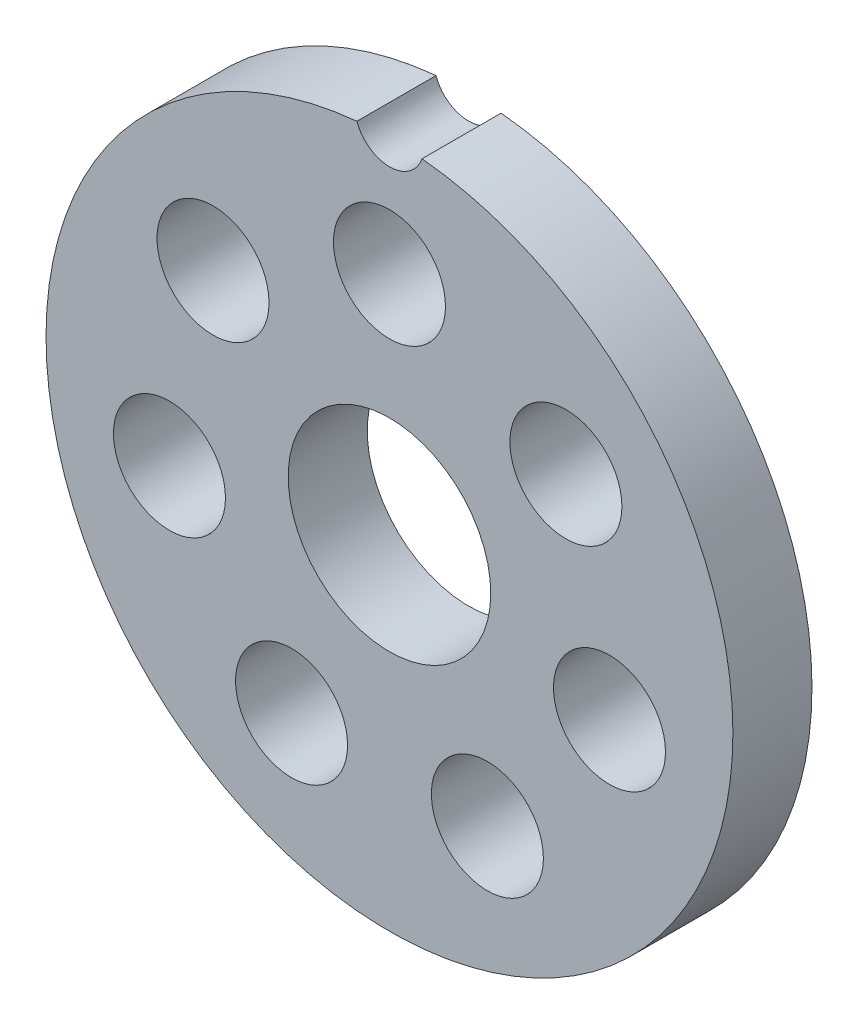
ISO-10303-21;
HEADER;
FILE_DESCRIPTION(('STEP AP214'),'2;1');
FILE_NAME('part.step','',(''),(''),'','','');
FILE_SCHEMA(('AUTOMOTIVE_DESIGN { 1 0 10303 214 1 1 1 1 }'));
ENDSEC;
DATA;
#1=APPLICATION_CONTEXT('core data for automotive mechanical design processes');
#2=APPLICATION_PROTOCOL_DEFINITION('international standard','automotive_design',2000,#1);
#3=PRODUCT_CONTEXT('',#1,'mechanical');
#4=PRODUCT('Part','Part','',(#3));
#5=PRODUCT_RELATED_PRODUCT_CATEGORY('part','',(#4));
#6=PRODUCT_DEFINITION_FORMATION('','',#4);
#7=PRODUCT_DEFINITION_CONTEXT('part definition',#1,'design');
#8=PRODUCT_DEFINITION('design','',#6,#7);
#9=PRODUCT_DEFINITION_SHAPE('','',#8);
#10=(LENGTH_UNIT() NAMED_UNIT(*) SI_UNIT(.MILLI.,.METRE.));
#11=(NAMED_UNIT(*) PLANE_ANGLE_UNIT() SI_UNIT($,.RADIAN.));
#12=(NAMED_UNIT(*) SI_UNIT($,.STERADIAN.) SOLID_ANGLE_UNIT());
#13=UNCERTAINTY_MEASURE_WITH_UNIT(LENGTH_MEASURE(1.E-05),#10,'distance_accuracy_value','');
#14=(GEOMETRIC_REPRESENTATION_CONTEXT(3) GLOBAL_UNCERTAINTY_ASSIGNED_CONTEXT((#13)) GLOBAL_UNIT_ASSIGNED_CONTEXT((#10,
#11,#12)) REPRESENTATION_CONTEXT('',''));
#15=CARTESIAN_POINT('',(0.,0.,0.));
#16=DIRECTION('',(0.,0.,1.));
#17=DIRECTION('',(1.,0.,0.));
#18=AXIS2_PLACEMENT_3D('',#15,#16,#17);
#19=CARTESIAN_POINT('',(0.,10.8915272879839,2.4384));
#20=DIRECTION('',(0.,0.,-1.));
#21=DIRECTION('',(-1.,0.,0.));
#22=AXIS2_PLACEMENT_3D('',#19,#20,#21);
#23=CYLINDRICAL_SURFACE('',#22,1.0617272879839);
#24=CARTESIAN_POINT('',(0.,10.8915272879839,0.));
#25=DIRECTION('',(0.,0.,1.));
#26=DIRECTION('',(1.,0.,0.));
#27=AXIS2_PLACEMENT_3D('',#24,#25,#26);
#28=CIRCLE('',#27,1.0617272879839);
#29=CARTESIAN_POINT('',(-1.00329999999999,10.5441745219813,0.));
#30=VERTEX_POINT('',#29);
#31=CARTESIAN_POINT('',(1.00329999999999,10.5441745219813,0.));
#32=VERTEX_POINT('',#31);
#33=EDGE_CURVE('E64',#30,#32,#28,.T.);
#34=ORIENTED_EDGE('',*,*,#33,.F.);
#35=DIRECTION('',(0.,0.,-1.));
#36=VECTOR('',#35,1.);
#37=CARTESIAN_POINT('',(-1.00329999999999,10.5441745219813,2.4384));
#38=LINE('',#37,#36);
#39=CARTESIAN_POINT('',(-1.00329999999999,10.5441745219813,2.4384));
#40=VERTEX_POINT('',#39);
#41=EDGE_CURVE('E11',#40,#30,#38,.T.);
#42=ORIENTED_EDGE('',*,*,#41,.F.);
#43=CARTESIAN_POINT('',(0.,10.8915272879839,2.4384));
#44=DIRECTION('',(0.,0.,1.));
#45=DIRECTION('',(1.,0.,0.));
#46=AXIS2_PLACEMENT_3D('',#43,#44,#45);
#47=CIRCLE('',#46,1.0617272879839);
#48=CARTESIAN_POINT('',(1.00329999999999,10.5441745219813,2.4384));
#49=VERTEX_POINT('',#48);
#50=EDGE_CURVE('E65',#40,#49,#47,.T.);
#51=ORIENTED_EDGE('',*,*,#50,.T.);
#52=DIRECTION('',(0.,0.,-1.));
#53=VECTOR('',#52,1.);
#54=CARTESIAN_POINT('',(1.00329999999999,10.5441745219813,2.4384));
#55=LINE('',#54,#53);
#56=EDGE_CURVE('E44',#49,#32,#55,.T.);
#57=ORIENTED_EDGE('',*,*,#56,.T.);
#58=EDGE_LOOP('',(#34,#42,#51,#57));
#59=FACE_BOUND('',#58,.T.);
#60=ADVANCED_FACE('F35',(#59),#23,.F.);
#61=CARTESIAN_POINT('',(0.,6.9596,2.4384));
#62=DIRECTION('',(0.,0.,-1.));
#63=DIRECTION('',(-1.,0.,0.));
#64=AXIS2_PLACEMENT_3D('',#61,#62,#63);
#65=CYLINDRICAL_SURFACE('',#64,1.7272);
#66=CARTESIAN_POINT('',(0.,6.9596,2.4384));
#67=DIRECTION('',(0.,0.,1.));
#68=DIRECTION('',(1.,0.,0.));
#69=AXIS2_PLACEMENT_3D('',#66,#67,#68);
#70=CIRCLE('',#69,1.7272);
#71=CARTESIAN_POINT('',(1.7272,6.9596,2.4384));
#72=VERTEX_POINT('',#71);
#73=EDGE_CURVE('E110',#72,#72,#70,.T.);
#74=ORIENTED_EDGE('',*,*,#73,.T.);
#75=EDGE_LOOP('',(#74));
#76=FACE_BOUND('',#75,.T.);
#77=CARTESIAN_POINT('',(0.,6.9596,0.));
#78=DIRECTION('',(0.,0.,1.));
#79=DIRECTION('',(1.,0.,0.));
#80=AXIS2_PLACEMENT_3D('',#77,#78,#79);
#81=CIRCLE('',#80,1.7272);
#82=CARTESIAN_POINT('',(1.7272,6.9596,0.));
#83=VERTEX_POINT('',#82);
#84=EDGE_CURVE('E70',#83,#83,#81,.T.);
#85=ORIENTED_EDGE('',*,*,#84,.F.);
#86=EDGE_LOOP('',(#85));
#87=FACE_BOUND('',#86,.T.);
#88=ADVANCED_FACE('F147',(#76,#87),#65,.F.);
#89=CARTESIAN_POINT('',(0.,0.,2.4384));
#90=DIRECTION('',(0.,0.,-1.));
#91=DIRECTION('',(-1.,0.,0.));
#92=AXIS2_PLACEMENT_3D('',#89,#90,#91);
#93=CYLINDRICAL_SURFACE('',#92,10.5918);
#94=CARTESIAN_POINT('',(0.,0.,0.));
#95=DIRECTION('',(0.,0.,1.));
#96=DIRECTION('',(1.,0.,0.));
#97=AXIS2_PLACEMENT_3D('',#94,#95,#96);
#98=CIRCLE('',#97,10.5918);
#99=EDGE_CURVE('E67',#30,#32,#98,.T.);
#100=ORIENTED_EDGE('',*,*,#99,.T.);
#101=ORIENTED_EDGE('',*,*,#56,.F.);
#102=CARTESIAN_POINT('',(0.,0.,2.4384));
#103=DIRECTION('',(0.,0.,1.));
#104=DIRECTION('',(1.,0.,0.));
#105=AXIS2_PLACEMENT_3D('',#102,#103,#104);
#106=CIRCLE('',#105,10.5918);
#107=EDGE_CURVE('E51',#40,#49,#106,.T.);
#108=ORIENTED_EDGE('',*,*,#107,.F.);
#109=ORIENTED_EDGE('',*,*,#41,.T.);
#110=EDGE_LOOP('',(#100,#101,#108,#109));
#111=FACE_BOUND('',#110,.T.);
#112=ADVANCED_FACE('F68',(#111),#93,.T.);
#113=CARTESIAN_POINT('',(-5.4412343853845,4.33923962501604,2.4384));
#114=DIRECTION('',(0.,0.,-1.));
#115=DIRECTION('',(-1.,0.,0.));
#116=AXIS2_PLACEMENT_3D('',#113,#114,#115);
#117=CYLINDRICAL_SURFACE('',#116,1.7272);
#118=CARTESIAN_POINT('',(-5.4412343853845,4.33923962501604,2.4384));
#119=DIRECTION('',(0.,0.,1.));
#120=DIRECTION('',(1.,0.,0.));
#121=AXIS2_PLACEMENT_3D('',#118,#119,#120);
#122=CIRCLE('',#121,1.7272);
#123=CARTESIAN_POINT('',(-3.7140343853845,4.33923962501604,2.4384));
#124=VERTEX_POINT('',#123);
#125=EDGE_CURVE('E105',#124,#124,#122,.T.);
#126=ORIENTED_EDGE('',*,*,#125,.T.);
#127=EDGE_LOOP('',(#126));
#128=FACE_BOUND('',#127,.T.);
#129=CARTESIAN_POINT('',(-5.4412343853845,4.33923962501604,0.));
#130=DIRECTION('',(0.,0.,1.));
#131=DIRECTION('',(1.,0.,0.));
#132=AXIS2_PLACEMENT_3D('',#129,#130,#131);
#133=CIRCLE('',#132,1.7272);
#134=CARTESIAN_POINT('',(-3.7140343853845,4.33923962501604,0.));
#135=VERTEX_POINT('',#134);
#136=EDGE_CURVE('E74',#135,#135,#133,.T.);
#137=ORIENTED_EDGE('',*,*,#136,.F.);
#138=EDGE_LOOP('',(#137));
#139=FACE_BOUND('',#138,.T.);
#140=ADVANCED_FACE('F134',(#128,#139),#117,.F.);
#141=CARTESIAN_POINT('',(-6.78510829762062,-1.54865669196237,2.4384));
#142=DIRECTION('',(0.,0.,-1.));
#143=DIRECTION('',(-1.,0.,0.));
#144=AXIS2_PLACEMENT_3D('',#141,#142,#143);
#145=CYLINDRICAL_SURFACE('',#144,1.7272);
#146=CARTESIAN_POINT('',(-6.78510829762062,-1.54865669196237,2.4384));
#147=DIRECTION('',(0.,0.,1.));
#148=DIRECTION('',(1.,0.,0.));
#149=AXIS2_PLACEMENT_3D('',#146,#147,#148);
#150=CIRCLE('',#149,1.7272);
#151=CARTESIAN_POINT('',(-5.05790829762062,-1.54865669196237,2.4384));
#152=VERTEX_POINT('',#151);
#153=EDGE_CURVE('E102',#152,#152,#150,.T.);
#154=ORIENTED_EDGE('',*,*,#153,.T.);
#155=EDGE_LOOP('',(#154));
#156=FACE_BOUND('',#155,.T.);
#157=CARTESIAN_POINT('',(-6.78510829762062,-1.54865669196237,0.));
#158=DIRECTION('',(0.,0.,1.));
#159=DIRECTION('',(1.,0.,0.));
#160=AXIS2_PLACEMENT_3D('',#157,#158,#159);
#161=CIRCLE('',#160,1.7272);
#162=CARTESIAN_POINT('',(-5.05790829762062,-1.54865669196237,0.));
#163=VERTEX_POINT('',#162);
#164=EDGE_CURVE('E77',#163,#163,#161,.T.);
#165=ORIENTED_EDGE('',*,*,#164,.F.);
#166=EDGE_LOOP('',(#165));
#167=FACE_BOUND('',#166,.T.);
#168=ADVANCED_FACE('F131',(#156,#167),#145,.F.);
#169=CARTESIAN_POINT('',(-3.01965727076256,-6.27038293305368,2.4384));
#170=DIRECTION('',(0.,0.,-1.));
#171=DIRECTION('',(-1.,0.,0.));
#172=AXIS2_PLACEMENT_3D('',#169,#170,#171);
#173=CYLINDRICAL_SURFACE('',#172,1.7272);
#174=CARTESIAN_POINT('',(-3.01965727076256,-6.27038293305368,2.4384));
#175=DIRECTION('',(0.,0.,1.));
#176=DIRECTION('',(1.,0.,0.));
#177=AXIS2_PLACEMENT_3D('',#174,#175,#176);
#178=CIRCLE('',#177,1.7272);
#179=CARTESIAN_POINT('',(-1.29245727076256,-6.27038293305368,2.4384));
#180=VERTEX_POINT('',#179);
#181=EDGE_CURVE('E99',#180,#180,#178,.T.);
#182=ORIENTED_EDGE('',*,*,#181,.T.);
#183=EDGE_LOOP('',(#182));
#184=FACE_BOUND('',#183,.T.);
#185=CARTESIAN_POINT('',(-3.01965727076256,-6.27038293305368,0.));
#186=DIRECTION('',(0.,0.,1.));
#187=DIRECTION('',(1.,0.,0.));
#188=AXIS2_PLACEMENT_3D('',#185,#186,#187);
#189=CIRCLE('',#188,1.7272);
#190=CARTESIAN_POINT('',(-1.29245727076256,-6.27038293305368,0.));
#191=VERTEX_POINT('',#190);
#192=EDGE_CURVE('E124',#191,#191,#189,.T.);
#193=ORIENTED_EDGE('',*,*,#192,.F.);
#194=EDGE_LOOP('',(#193));
#195=FACE_BOUND('',#194,.T.);
#196=ADVANCED_FACE('F133',(#184,#195),#173,.F.);
#197=CARTESIAN_POINT('',(3.01965727076256,-6.27038293305368,2.4384));
#198=DIRECTION('',(0.,0.,-1.));
#199=DIRECTION('',(-1.,0.,0.));
#200=AXIS2_PLACEMENT_3D('',#197,#198,#199);
#201=CYLINDRICAL_SURFACE('',#200,1.7272);
#202=CARTESIAN_POINT('',(3.01965727076256,-6.27038293305368,2.4384));
#203=DIRECTION('',(0.,0.,1.));
#204=DIRECTION('',(1.,0.,0.));
#205=AXIS2_PLACEMENT_3D('',#202,#203,#204);
#206=CIRCLE('',#205,1.7272);
#207=CARTESIAN_POINT('',(4.74685727076256,-6.27038293305368,2.4384));
#208=VERTEX_POINT('',#207);
#209=EDGE_CURVE('E94',#208,#208,#206,.T.);
#210=ORIENTED_EDGE('',*,*,#209,.T.);
#211=EDGE_LOOP('',(#210));
#212=FACE_BOUND('',#211,.T.);
#213=CARTESIAN_POINT('',(3.01965727076256,-6.27038293305368,0.));
#214=DIRECTION('',(0.,0.,1.));
#215=DIRECTION('',(1.,0.,0.));
#216=AXIS2_PLACEMENT_3D('',#213,#214,#215);
#217=CIRCLE('',#216,1.7272);
#218=CARTESIAN_POINT('',(4.74685727076256,-6.27038293305368,0.));
#219=VERTEX_POINT('',#218);
#220=EDGE_CURVE('E121',#219,#219,#217,.T.);
#221=ORIENTED_EDGE('',*,*,#220,.F.);
#222=EDGE_LOOP('',(#221));
#223=FACE_BOUND('',#222,.T.);
#224=ADVANCED_FACE('F141',(#212,#223),#201,.F.);
#225=CARTESIAN_POINT('',(6.78510829762062,-1.54865669196236,2.4384));
#226=DIRECTION('',(0.,0.,-1.));
#227=DIRECTION('',(-1.,0.,0.));
#228=AXIS2_PLACEMENT_3D('',#225,#226,#227);
#229=CYLINDRICAL_SURFACE('',#228,1.7272);
#230=CARTESIAN_POINT('',(6.78510829762062,-1.54865669196236,2.4384));
#231=DIRECTION('',(0.,0.,1.));
#232=DIRECTION('',(1.,0.,0.));
#233=AXIS2_PLACEMENT_3D('',#230,#231,#232);
#234=CIRCLE('',#233,1.7272);
#235=CARTESIAN_POINT('',(8.51230829762062,-1.54865669196236,2.4384));
#236=VERTEX_POINT('',#235);
#237=EDGE_CURVE('E89',#236,#236,#234,.T.);
#238=ORIENTED_EDGE('',*,*,#237,.T.);
#239=EDGE_LOOP('',(#238));
#240=FACE_BOUND('',#239,.T.);
#241=CARTESIAN_POINT('',(6.78510829762062,-1.54865669196236,0.));
#242=DIRECTION('',(0.,0.,1.));
#243=DIRECTION('',(1.,0.,0.));
#244=AXIS2_PLACEMENT_3D('',#241,#242,#243);
#245=CIRCLE('',#244,1.7272);
#246=CARTESIAN_POINT('',(8.51230829762062,-1.54865669196236,0.));
#247=VERTEX_POINT('',#246);
#248=EDGE_CURVE('E118',#247,#247,#245,.T.);
#249=ORIENTED_EDGE('',*,*,#248,.F.);
#250=EDGE_LOOP('',(#249));
#251=FACE_BOUND('',#250,.T.);
#252=ADVANCED_FACE('F194',(#240,#251),#229,.F.);
#253=CARTESIAN_POINT('',(5.4412343853845,4.33923962501604,2.4384));
#254=DIRECTION('',(0.,0.,-1.));
#255=DIRECTION('',(-1.,0.,0.));
#256=AXIS2_PLACEMENT_3D('',#253,#254,#255);
#257=CYLINDRICAL_SURFACE('',#256,1.7272);
#258=CARTESIAN_POINT('',(5.4412343853845,4.33923962501604,2.4384));
#259=DIRECTION('',(0.,0.,1.));
#260=DIRECTION('',(1.,0.,0.));
#261=AXIS2_PLACEMENT_3D('',#258,#259,#260);
#262=CIRCLE('',#261,1.7272);
#263=CARTESIAN_POINT('',(7.1684343853845,4.33923962501604,2.4384));
#264=VERTEX_POINT('',#263);
#265=EDGE_CURVE('E85',#264,#264,#262,.T.);
#266=ORIENTED_EDGE('',*,*,#265,.T.);
#267=EDGE_LOOP('',(#266));
#268=FACE_BOUND('',#267,.T.);
#269=CARTESIAN_POINT('',(5.4412343853845,4.33923962501604,0.));
#270=DIRECTION('',(0.,0.,1.));
#271=DIRECTION('',(1.,0.,0.));
#272=AXIS2_PLACEMENT_3D('',#269,#270,#271);
#273=CIRCLE('',#272,1.7272);
#274=CARTESIAN_POINT('',(7.1684343853845,4.33923962501604,0.));
#275=VERTEX_POINT('',#274);
#276=EDGE_CURVE('E115',#275,#275,#273,.T.);
#277=ORIENTED_EDGE('',*,*,#276,.F.);
#278=EDGE_LOOP('',(#277));
#279=FACE_BOUND('',#278,.T.);
#280=ADVANCED_FACE('F37',(#268,#279),#257,.F.);
#281=CARTESIAN_POINT('',(0.,0.,2.4384));
#282=DIRECTION('',(0.,0.,-1.));
#283=DIRECTION('',(-1.,0.,0.));
#284=AXIS2_PLACEMENT_3D('',#281,#282,#283);
#285=CYLINDRICAL_SURFACE('',#284,3.1242);
#286=CARTESIAN_POINT('',(0.,0.,2.4384));
#287=DIRECTION('',(0.,0.,1.));
#288=DIRECTION('',(1.,0.,0.));
#289=AXIS2_PLACEMENT_3D('',#286,#287,#288);
#290=CIRCLE('',#289,3.1242);
#291=CARTESIAN_POINT('',(3.1242,0.,2.4384));
#292=VERTEX_POINT('',#291);
#293=EDGE_CURVE('E66',#292,#292,#290,.T.);
#294=ORIENTED_EDGE('',*,*,#293,.T.);
#295=EDGE_LOOP('',(#294));
#296=FACE_BOUND('',#295,.T.);
#297=CARTESIAN_POINT('',(0.,0.,0.));
#298=DIRECTION('',(0.,0.,1.));
#299=DIRECTION('',(1.,0.,0.));
#300=AXIS2_PLACEMENT_3D('',#297,#298,#299);
#301=CIRCLE('',#300,3.1242);
#302=CARTESIAN_POINT('',(3.1242,0.,0.));
#303=VERTEX_POINT('',#302);
#304=EDGE_CURVE('E83',#303,#303,#301,.T.);
#305=ORIENTED_EDGE('',*,*,#304,.F.);
#306=EDGE_LOOP('',(#305));
#307=FACE_BOUND('',#306,.T.);
#308=ADVANCED_FACE('F157',(#296,#307),#285,.F.);
#309=CARTESIAN_POINT('',(0.,0.,2.4384));
#310=DIRECTION('',(0.,0.,1.));
#311=DIRECTION('',(1.,0.,0.));
#312=AXIS2_PLACEMENT_3D('',#309,#310,#311);
#313=PLANE('',#312);
#314=ORIENTED_EDGE('',*,*,#265,.F.);
#315=EDGE_LOOP('',(#314));
#316=FACE_BOUND('',#315,.T.);
#317=ORIENTED_EDGE('',*,*,#237,.F.);
#318=EDGE_LOOP('',(#317));
#319=FACE_BOUND('',#318,.T.);
#320=ORIENTED_EDGE('',*,*,#209,.F.);
#321=EDGE_LOOP('',(#320));
#322=FACE_BOUND('',#321,.T.);
#323=ORIENTED_EDGE('',*,*,#181,.F.);
#324=EDGE_LOOP('',(#323));
#325=FACE_BOUND('',#324,.T.);
#326=ORIENTED_EDGE('',*,*,#153,.F.);
#327=EDGE_LOOP('',(#326));
#328=FACE_BOUND('',#327,.T.);
#329=ORIENTED_EDGE('',*,*,#125,.F.);
#330=EDGE_LOOP('',(#329));
#331=FACE_BOUND('',#330,.T.);
#332=ORIENTED_EDGE('',*,*,#50,.F.);
#333=ORIENTED_EDGE('',*,*,#107,.T.);
#334=EDGE_LOOP('',(#332,#333));
#335=FACE_BOUND('',#334,.T.);
#336=ORIENTED_EDGE('',*,*,#73,.F.);
#337=EDGE_LOOP('',(#336));
#338=FACE_BOUND('',#337,.T.);
#339=ORIENTED_EDGE('',*,*,#293,.F.);
#340=EDGE_LOOP('',(#339));
#341=FACE_BOUND('',#340,.T.);
#342=ADVANCED_FACE('F160',(#316,#319,#322,#325,#328,#331,#335,#338,#341),#313,.T.);
#343=CARTESIAN_POINT('',(0.,0.,0.));
#344=DIRECTION('',(0.,0.,1.));
#345=DIRECTION('',(1.,0.,0.));
#346=AXIS2_PLACEMENT_3D('',#343,#344,#345);
#347=PLANE('',#346);
#348=ORIENTED_EDGE('',*,*,#276,.T.);
#349=EDGE_LOOP('',(#348));
#350=FACE_BOUND('',#349,.T.);
#351=ORIENTED_EDGE('',*,*,#248,.T.);
#352=EDGE_LOOP('',(#351));
#353=FACE_BOUND('',#352,.T.);
#354=ORIENTED_EDGE('',*,*,#220,.T.);
#355=EDGE_LOOP('',(#354));
#356=FACE_BOUND('',#355,.T.);
#357=ORIENTED_EDGE('',*,*,#192,.T.);
#358=EDGE_LOOP('',(#357));
#359=FACE_BOUND('',#358,.T.);
#360=ORIENTED_EDGE('',*,*,#164,.T.);
#361=EDGE_LOOP('',(#360));
#362=FACE_BOUND('',#361,.T.);
#363=ORIENTED_EDGE('',*,*,#136,.T.);
#364=EDGE_LOOP('',(#363));
#365=FACE_BOUND('',#364,.T.);
#366=ORIENTED_EDGE('',*,*,#33,.T.);
#367=ORIENTED_EDGE('',*,*,#99,.F.);
#368=EDGE_LOOP('',(#366,#367));
#369=FACE_BOUND('',#368,.T.);
#370=ORIENTED_EDGE('',*,*,#84,.T.);
#371=EDGE_LOOP('',(#370));
#372=FACE_BOUND('',#371,.T.);
#373=ORIENTED_EDGE('',*,*,#304,.T.);
#374=EDGE_LOOP('',(#373));
#375=FACE_BOUND('',#374,.T.);
#376=ADVANCED_FACE('F72',(#350,#353,#356,#359,#362,#365,#369,#372,#375),#347,.F.);
#377=CLOSED_SHELL('',(#60,#88,#112,#140,#168,#196,#224,#252,#280,#308,#342,#376));
#378=MANIFOLD_SOLID_BREP('B2',#377);
#379=ADVANCED_BREP_SHAPE_REPRESENTATION('',(#18,#378),#14);
#380=SHAPE_DEFINITION_REPRESENTATION(#9,#379);
ENDSEC;
END-ISO-10303-21;
